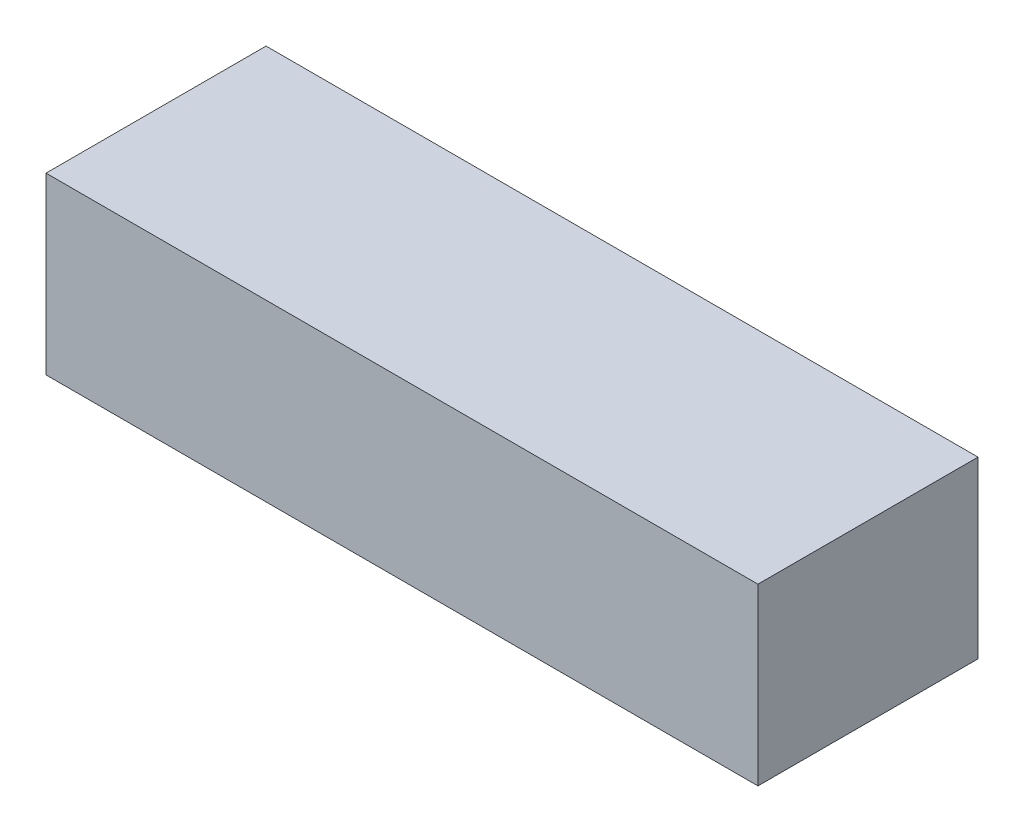
ISO-10303-21;
HEADER;
FILE_DESCRIPTION(('STEP AP214'),'2;1');
FILE_NAME('part.step','',(''),(''),'','','');
FILE_SCHEMA(('AUTOMOTIVE_DESIGN { 1 0 10303 214 1 1 1 1 }'));
ENDSEC;
DATA;
#1=APPLICATION_CONTEXT('core data for automotive mechanical design processes');
#2=APPLICATION_PROTOCOL_DEFINITION('international standard','automotive_design',2000,#1);
#3=PRODUCT_CONTEXT('',#1,'mechanical');
#4=PRODUCT('Part','Part','',(#3));
#5=PRODUCT_RELATED_PRODUCT_CATEGORY('part','',(#4));
#6=PRODUCT_DEFINITION_FORMATION('','',#4);
#7=PRODUCT_DEFINITION_CONTEXT('part definition',#1,'design');
#8=PRODUCT_DEFINITION('design','',#6,#7);
#9=PRODUCT_DEFINITION_SHAPE('','',#8);
#10=(LENGTH_UNIT() NAMED_UNIT(*) SI_UNIT(.MILLI.,.METRE.));
#11=(NAMED_UNIT(*) PLANE_ANGLE_UNIT() SI_UNIT($,.RADIAN.));
#12=(NAMED_UNIT(*) SI_UNIT($,.STERADIAN.) SOLID_ANGLE_UNIT());
#13=UNCERTAINTY_MEASURE_WITH_UNIT(LENGTH_MEASURE(1.E-05),#10,'distance_accuracy_value','');
#14=(GEOMETRIC_REPRESENTATION_CONTEXT(3) GLOBAL_UNCERTAINTY_ASSIGNED_CONTEXT((#13)) GLOBAL_UNIT_ASSIGNED_CONTEXT((#10,
#11,#12)) REPRESENTATION_CONTEXT('',''));
#15=CARTESIAN_POINT('',(0.,0.,0.));
#16=DIRECTION('',(0.,0.,1.));
#17=DIRECTION('',(1.,0.,0.));
#18=AXIS2_PLACEMENT_3D('',#15,#16,#17);
#19=CARTESIAN_POINT('',(55.,27.,-17.));
#20=DIRECTION('',(-1.,0.,0.));
#21=DIRECTION('',(0.,0.,1.));
#22=AXIS2_PLACEMENT_3D('',#19,#20,#21);
#23=PLANE('',#22);
#24=DIRECTION('',(0.,0.,-1.));
#25=VECTOR('',#24,1.);
#26=CARTESIAN_POINT('',(55.,0.,-17.));
#27=LINE('',#26,#25);
#28=CARTESIAN_POINT('',(55.,0.,17.));
#29=VERTEX_POINT('',#28);
#30=CARTESIAN_POINT('',(55.,0.,-17.));
#31=VERTEX_POINT('',#30);
#32=EDGE_CURVE('E98',#29,#31,#27,.T.);
#33=ORIENTED_EDGE('',*,*,#32,.T.);
#34=DIRECTION('',(0.,-1.,0.));
#35=VECTOR('',#34,1.);
#36=CARTESIAN_POINT('',(55.,27.,-17.));
#37=LINE('',#36,#35);
#38=CARTESIAN_POINT('',(55.,27.,-17.));
#39=VERTEX_POINT('',#38);
#40=EDGE_CURVE('E11',#39,#31,#37,.T.);
#41=ORIENTED_EDGE('',*,*,#40,.F.);
#42=DIRECTION('',(0.,0.,-1.));
#43=VECTOR('',#42,1.);
#44=CARTESIAN_POINT('',(55.,27.,-17.));
#45=LINE('',#44,#43);
#46=CARTESIAN_POINT('',(55.,27.,17.));
#47=VERTEX_POINT('',#46);
#48=EDGE_CURVE('E86',#47,#39,#45,.T.);
#49=ORIENTED_EDGE('',*,*,#48,.F.);
#50=DIRECTION('',(0.,-1.,0.));
#51=VECTOR('',#50,1.);
#52=CARTESIAN_POINT('',(55.,27.,17.));
#53=LINE('',#52,#51);
#54=EDGE_CURVE('E94',#47,#29,#53,.T.);
#55=ORIENTED_EDGE('',*,*,#54,.T.);
#56=EDGE_LOOP('',(#33,#41,#49,#55));
#57=FACE_BOUND('',#56,.T.);
#58=ADVANCED_FACE('F35',(#57),#23,.F.);
#59=CARTESIAN_POINT('',(-55.,27.,-17.));
#60=DIRECTION('',(0.,0.,1.));
#61=DIRECTION('',(1.,0.,0.));
#62=AXIS2_PLACEMENT_3D('',#59,#60,#61);
#63=PLANE('',#62);
#64=DIRECTION('',(-1.,0.,0.));
#65=VECTOR('',#64,1.);
#66=CARTESIAN_POINT('',(-55.,0.,-17.));
#67=LINE('',#66,#65);
#68=CARTESIAN_POINT('',(-55.,0.,-17.));
#69=VERTEX_POINT('',#68);
#70=EDGE_CURVE('E90',#31,#69,#67,.T.);
#71=ORIENTED_EDGE('',*,*,#70,.T.);
#72=DIRECTION('',(0.,-1.,0.));
#73=VECTOR('',#72,1.);
#74=CARTESIAN_POINT('',(-55.,27.,-17.));
#75=LINE('',#74,#73);
#76=CARTESIAN_POINT('',(-55.,27.,-17.));
#77=VERTEX_POINT('',#76);
#78=EDGE_CURVE('E43',#77,#69,#75,.T.);
#79=ORIENTED_EDGE('',*,*,#78,.F.);
#80=DIRECTION('',(-1.,0.,0.));
#81=VECTOR('',#80,1.);
#82=CARTESIAN_POINT('',(-55.,27.,-17.));
#83=LINE('',#82,#81);
#84=EDGE_CURVE('E81',#39,#77,#83,.T.);
#85=ORIENTED_EDGE('',*,*,#84,.F.);
#86=ORIENTED_EDGE('',*,*,#40,.T.);
#87=EDGE_LOOP('',(#71,#79,#85,#86));
#88=FACE_BOUND('',#87,.T.);
#89=ADVANCED_FACE('F89',(#88),#63,.F.);
#90=CARTESIAN_POINT('',(-55.,27.,-17.));
#91=DIRECTION('',(1.,0.,0.));
#92=DIRECTION('',(0.,0.,-1.));
#93=AXIS2_PLACEMENT_3D('',#90,#91,#92);
#94=PLANE('',#93);
#95=DIRECTION('',(0.,0.,1.));
#96=VECTOR('',#95,1.);
#97=CARTESIAN_POINT('',(-55.,0.,-17.));
#98=LINE('',#97,#96);
#99=CARTESIAN_POINT('',(-55.,0.,17.));
#100=VERTEX_POINT('',#99);
#101=EDGE_CURVE('E68',#69,#100,#98,.T.);
#102=ORIENTED_EDGE('',*,*,#101,.T.);
#103=DIRECTION('',(0.,-1.,0.));
#104=VECTOR('',#103,1.);
#105=CARTESIAN_POINT('',(-55.,27.,17.));
#106=LINE('',#105,#104);
#107=CARTESIAN_POINT('',(-55.,27.,17.));
#108=VERTEX_POINT('',#107);
#109=EDGE_CURVE('E91',#108,#100,#106,.T.);
#110=ORIENTED_EDGE('',*,*,#109,.F.);
#111=DIRECTION('',(0.,0.,1.));
#112=VECTOR('',#111,1.);
#113=CARTESIAN_POINT('',(-55.,27.,-17.));
#114=LINE('',#113,#112);
#115=EDGE_CURVE('E84',#77,#108,#114,.T.);
#116=ORIENTED_EDGE('',*,*,#115,.F.);
#117=ORIENTED_EDGE('',*,*,#78,.T.);
#118=EDGE_LOOP('',(#102,#110,#116,#117));
#119=FACE_BOUND('',#118,.T.);
#120=ADVANCED_FACE('F92',(#119),#94,.F.);
#121=CARTESIAN_POINT('',(-55.,27.,17.));
#122=DIRECTION('',(0.,0.,-1.));
#123=DIRECTION('',(-1.,0.,0.));
#124=AXIS2_PLACEMENT_3D('',#121,#122,#123);
#125=PLANE('',#124);
#126=DIRECTION('',(1.,0.,0.));
#127=VECTOR('',#126,1.);
#128=CARTESIAN_POINT('',(-55.,0.,17.));
#129=LINE('',#128,#127);
#130=EDGE_CURVE('E74',#100,#29,#129,.T.);
#131=ORIENTED_EDGE('',*,*,#130,.T.);
#132=ORIENTED_EDGE('',*,*,#54,.F.);
#133=DIRECTION('',(1.,0.,0.));
#134=VECTOR('',#133,1.);
#135=CARTESIAN_POINT('',(-55.,27.,17.));
#136=LINE('',#135,#134);
#137=EDGE_CURVE('E51',#108,#47,#136,.T.);
#138=ORIENTED_EDGE('',*,*,#137,.F.);
#139=ORIENTED_EDGE('',*,*,#109,.T.);
#140=EDGE_LOOP('',(#131,#132,#138,#139));
#141=FACE_BOUND('',#140,.T.);
#142=ADVANCED_FACE('F105',(#141),#125,.F.);
#143=CARTESIAN_POINT('',(0.,27.,0.));
#144=DIRECTION('',(0.,1.,0.));
#145=DIRECTION('',(0.,0.,1.));
#146=AXIS2_PLACEMENT_3D('',#143,#144,#145);
#147=PLANE('',#146);
#148=ORIENTED_EDGE('',*,*,#48,.T.);
#149=ORIENTED_EDGE('',*,*,#84,.T.);
#150=ORIENTED_EDGE('',*,*,#115,.T.);
#151=ORIENTED_EDGE('',*,*,#137,.T.);
#152=EDGE_LOOP('',(#148,#149,#150,#151));
#153=FACE_BOUND('',#152,.T.);
#154=ADVANCED_FACE('F82',(#153),#147,.T.);
#155=CARTESIAN_POINT('',(0.,0.,0.));
#156=DIRECTION('',(0.,1.,0.));
#157=DIRECTION('',(0.,0.,1.));
#158=AXIS2_PLACEMENT_3D('',#155,#156,#157);
#159=PLANE('',#158);
#160=ORIENTED_EDGE('',*,*,#32,.F.);
#161=ORIENTED_EDGE('',*,*,#130,.F.);
#162=ORIENTED_EDGE('',*,*,#101,.F.);
#163=ORIENTED_EDGE('',*,*,#70,.F.);
#164=EDGE_LOOP('',(#160,#161,#162,#163));
#165=FACE_BOUND('',#164,.T.);
#166=ADVANCED_FACE('F108',(#165),#159,.F.);
#167=CLOSED_SHELL('',(#58,#89,#120,#142,#154,#166));
#168=MANIFOLD_SOLID_BREP('B2',#167);
#169=ADVANCED_BREP_SHAPE_REPRESENTATION('',(#18,#168),#14);
#170=SHAPE_DEFINITION_REPRESENTATION(#9,#169);
ENDSEC;
END-ISO-10303-21;
